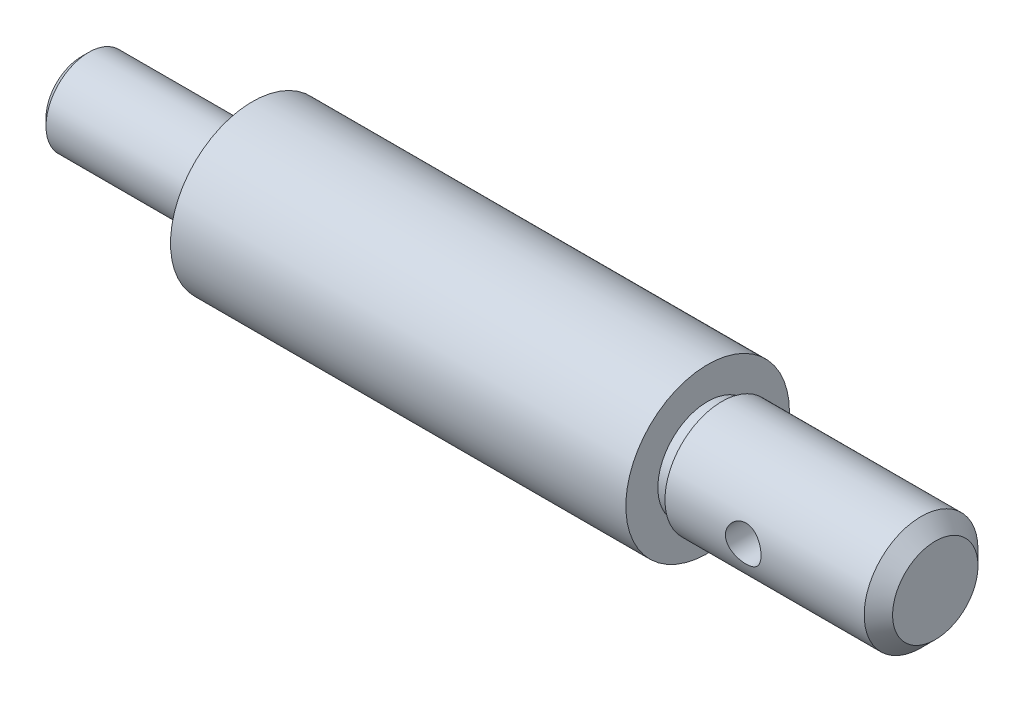
ISO-10303-21;
HEADER;
FILE_DESCRIPTION(('STEP AP214'),'2;1');
FILE_NAME('part.step','',(''),(''),'','','');
FILE_SCHEMA(('AUTOMOTIVE_DESIGN { 1 0 10303 214 1 1 1 1 }'));
ENDSEC;
DATA;
#1=APPLICATION_CONTEXT('core data for automotive mechanical design processes');
#2=APPLICATION_PROTOCOL_DEFINITION('international standard','automotive_design',2000,#1);
#3=PRODUCT_CONTEXT('',#1,'mechanical');
#4=PRODUCT('Part','Part','',(#3));
#5=PRODUCT_RELATED_PRODUCT_CATEGORY('part','',(#4));
#6=PRODUCT_DEFINITION_FORMATION('','',#4);
#7=PRODUCT_DEFINITION_CONTEXT('part definition',#1,'design');
#8=PRODUCT_DEFINITION('design','',#6,#7);
#9=PRODUCT_DEFINITION_SHAPE('','',#8);
#10=(LENGTH_UNIT() NAMED_UNIT(*) SI_UNIT(.MILLI.,.METRE.));
#11=(NAMED_UNIT(*) PLANE_ANGLE_UNIT() SI_UNIT($,.RADIAN.));
#12=(NAMED_UNIT(*) SI_UNIT($,.STERADIAN.) SOLID_ANGLE_UNIT());
#13=UNCERTAINTY_MEASURE_WITH_UNIT(LENGTH_MEASURE(1.E-05),#10,'distance_accuracy_value','');
#14=(GEOMETRIC_REPRESENTATION_CONTEXT(3) GLOBAL_UNCERTAINTY_ASSIGNED_CONTEXT((#13)) GLOBAL_UNIT_ASSIGNED_CONTEXT((#10,
#11,#12)) REPRESENTATION_CONTEXT('',''));
#15=CARTESIAN_POINT('',(0.,0.,0.));
#16=DIRECTION('',(0.,0.,1.));
#17=DIRECTION('',(1.,0.,0.));
#18=AXIS2_PLACEMENT_3D('',#15,#16,#17);
#19=CARTESIAN_POINT('',(0.,0.,0.));
#20=DIRECTION('',(1.,0.,0.));
#21=DIRECTION('',(0.,0.,-1.));
#22=AXIS2_PLACEMENT_3D('',#19,#20,#21);
#23=PLANE('',#22);
#24=CARTESIAN_POINT('',(0.,0.,0.));
#25=DIRECTION('',(1.,0.,0.));
#26=DIRECTION('',(0.,0.,-1.));
#27=AXIS2_PLACEMENT_3D('',#24,#25,#26);
#28=CIRCLE('',#27,5.99999999999998);
#29=CARTESIAN_POINT('',(0.,0.,-5.99999999999998));
#30=VERTEX_POINT('',#29);
#31=EDGE_CURVE('E48',#30,#30,#28,.T.);
#32=ORIENTED_EDGE('',*,*,#31,.T.);
#33=EDGE_LOOP('',(#32));
#34=FACE_BOUND('',#33,.T.);
#35=ADVANCED_FACE('F33',(#34),#23,.T.);
#36=CARTESIAN_POINT('',(0.,0.,0.));
#37=DIRECTION('',(1.,0.,0.));
#38=DIRECTION('',(0.,0.,-1.));
#39=AXIS2_PLACEMENT_3D('',#36,#37,#38);
#40=CYLINDRICAL_SURFACE('',#39,8.);
#41=CARTESIAN_POINT('',(-2.00000000000002,0.,0.));
#42=DIRECTION('',(1.,0.,0.));
#43=DIRECTION('',(0.,0.,-1.));
#44=AXIS2_PLACEMENT_3D('',#41,#42,#43);
#45=CIRCLE('',#44,8.);
#46=CARTESIAN_POINT('',(-2.00000000000002,0.,-8.));
#47=VERTEX_POINT('',#46);
#48=EDGE_CURVE('E44',#47,#47,#45,.F.);
#49=ORIENTED_EDGE('',*,*,#48,.T.);
#50=EDGE_LOOP('',(#49));
#51=FACE_BOUND('',#50,.T.);
#52=CARTESIAN_POINT('',(-21.5,0.,-8.));
#53=CARTESIAN_POINT('',(-21.4999991068248,0.136878370349093,-7.9999993175598));
#54=CARTESIAN_POINT('',(-21.4887215461111,0.273766105005719,-7.99645389969682));
#55=CARTESIAN_POINT('',(-21.4440275169215,0.543538419176897,-7.98265788177613));
#56=CARTESIAN_POINT('',(-21.4106060372713,0.676422085451814,-7.97240576399719));
#57=CARTESIAN_POINT('',(-21.3228612576085,0.934257087301613,-7.94631631395819));
#58=CARTESIAN_POINT('',(-21.2685703106941,1.05922035397161,-7.9304876299805));
#59=CARTESIAN_POINT('',(-21.1407653646433,1.29826960469292,-7.89487938322185));
#60=CARTESIAN_POINT('',(-21.0672483364388,1.41235387088977,-7.8750991979981));
#61=CARTESIAN_POINT('',(-20.9006880159653,1.62993066990456,-7.83300427480565));
#62=CARTESIAN_POINT('',(-20.8071582298779,1.73304005631332,-7.81063431853978));
#63=CARTESIAN_POINT('',(-20.6042632151729,1.92239476407399,-7.76620092748417));
#64=CARTESIAN_POINT('',(-20.4948950450109,2.00863694579739,-7.74413755046914));
#65=CARTESIAN_POINT('',(-20.2601108723838,2.16388672966227,-7.70222289396344));
#66=CARTESIAN_POINT('',(-20.1343650449456,2.23241568300257,-7.68243976603591));
#67=CARTESIAN_POINT('',(-19.8724153700363,2.34719482153343,-7.64815603598469));
#68=CARTESIAN_POINT('',(-19.7362142884121,2.39345087543889,-7.63365404257377));
#69=CARTESIAN_POINT('',(-19.4615438450959,2.46096919860067,-7.61215213969002));
#70=CARTESIAN_POINT('',(-19.3232663127223,2.48294220015729,-7.60493945859016));
#71=CARTESIAN_POINT('',(-19.0448137621762,2.50349110073976,-7.59820110281901));
#72=CARTESIAN_POINT('',(-18.9046392583567,2.50207321991544,-7.59867338454669));
#73=CARTESIAN_POINT('',(-18.632251079462,2.47643649465478,-7.60706378150876));
#74=CARTESIAN_POINT('',(-18.4999417482769,2.45312115738766,-7.61468683491897));
#75=CARTESIAN_POINT('',(-18.2412156869253,2.38581626711252,-7.63604051304978));
#76=CARTESIAN_POINT('',(-18.1147995845824,2.34182451689101,-7.6497717868623));
#77=CARTESIAN_POINT('',(-17.8692961111347,2.23377749362554,-7.68202088028593));
#78=CARTESIAN_POINT('',(-17.750342778616,2.16943851324164,-7.70060569321649));
#79=CARTESIAN_POINT('',(-17.5246244642418,2.02272041475696,-7.7404371316014));
#80=CARTESIAN_POINT('',(-17.4178626594926,1.94033661043154,-7.76168444789102));
#81=CARTESIAN_POINT('',(-17.214450113166,1.75543390836424,-7.80563055600986));
#82=CARTESIAN_POINT('',(-17.1184808844406,1.65216914118563,-7.82835139211391));
#83=CARTESIAN_POINT('',(-16.9450562128406,1.43072881619106,-7.87183141519161));
#84=CARTESIAN_POINT('',(-16.8676021415616,1.31255215469804,-7.89259045676745));
#85=CARTESIAN_POINT('',(-16.7329446227974,1.06332922093091,-7.93002589780382));
#86=CARTESIAN_POINT('',(-16.6759037290721,0.932189813838557,-7.94666921296415));
#87=CARTESIAN_POINT('',(-16.5848939982969,0.661535955565287,-7.97375911657108));
#88=CARTESIAN_POINT('',(-16.5509181555232,0.522024061449215,-7.98420758650304));
#89=CARTESIAN_POINT('',(-16.508163914842,0.244370314580689,-7.99742778790027));
#90=CARTESIAN_POINT('',(-16.4984629128129,0.106383697577685,-8.00048045790873));
#91=CARTESIAN_POINT('',(-16.5019324532747,-0.169260611465173,-7.99939599461967));
#92=CARTESIAN_POINT('',(-16.5150996546452,-0.306918348613019,-7.9952599116227));
#93=CARTESIAN_POINT('',(-16.5631911852128,-0.574438665951699,-7.98044727539523));
#94=CARTESIAN_POINT('',(-16.597566535225,-0.704409956841875,-7.96993586221374));
#95=CARTESIAN_POINT('',(-16.6864287047334,-0.956703857722755,-7.94360242758579));
#96=CARTESIAN_POINT('',(-16.74091800805,-1.07902552089812,-7.92777975028687));
#97=CARTESIAN_POINT('',(-16.8699464330974,-1.31586481334438,-7.89197085518848));
#98=CARTESIAN_POINT('',(-16.9449419749936,-1.43011947957558,-7.87189253635335));
#99=CARTESIAN_POINT('',(-17.1123064202349,-1.64473170192052,-7.82986820006859));
#100=CARTESIAN_POINT('',(-17.2046800354893,-1.7450854760879,-7.80792167695774));
#101=CARTESIAN_POINT('',(-17.4085177801042,-1.93317492583804,-7.76353989766283));
#102=CARTESIAN_POINT('',(-17.5205933274784,-2.02025304679063,-7.74111973412883));
#103=CARTESIAN_POINT('',(-17.7582532327535,-2.17442500490303,-7.69923894191212));
#104=CARTESIAN_POINT('',(-17.883837376054,-2.24151915946859,-7.67977826622621));
#105=CARTESIAN_POINT('',(-18.144690345741,-2.35340166961084,-7.64623564661738));
#106=CARTESIAN_POINT('',(-18.2799192988714,-2.39827639112025,-7.63213292713749));
#107=CARTESIAN_POINT('',(-18.5565449864972,-2.4644578863618,-7.6110234168862));
#108=CARTESIAN_POINT('',(-18.6979393526871,-2.48577362827989,-7.60401392602456));
#109=CARTESIAN_POINT('',(-18.9760081751609,-2.50358812316251,-7.59816585427753));
#110=CARTESIAN_POINT('',(-19.1126069076948,-2.50116559243271,-7.59897209200284));
#111=CARTESIAN_POINT('',(-19.3833491698839,-2.47417636257667,-7.60780180751807));
#112=CARTESIAN_POINT('',(-19.5174928137735,-2.44961069645024,-7.61582494863208));
#113=CARTESIAN_POINT('',(-19.7775880791838,-2.37975459827235,-7.6379362836678));
#114=CARTESIAN_POINT('',(-19.9036308821867,-2.33477284812016,-7.65193396380513));
#115=CARTESIAN_POINT('',(-20.146480827068,-2.22560454669999,-7.68439408509128));
#116=CARTESIAN_POINT('',(-20.2632860841568,-2.16141408888473,-7.70285743429343));
#117=CARTESIAN_POINT('',(-20.4892919408796,-2.01271350026986,-7.74306974067005));
#118=CARTESIAN_POINT('',(-20.5980162590005,-1.92750667048264,-7.76491897845913));
#119=CARTESIAN_POINT('',(-20.799972656224,-1.7404179928096,-7.8089799764242));
#120=CARTESIAN_POINT('',(-20.8932005779821,-1.63853168468878,-7.83119183213309));
#121=CARTESIAN_POINT('',(-21.0645650767259,-1.41697332564669,-7.87434543904947));
#122=CARTESIAN_POINT('',(-21.1421094728999,-1.29682914897477,-7.89522203461346));
#123=CARTESIAN_POINT('',(-21.2757978302789,-1.0445582760273,-7.93253538593756));
#124=CARTESIAN_POINT('',(-21.3319502042837,-0.912436315590894,-7.94897388631644));
#125=CARTESIAN_POINT('',(-21.4171827352169,-0.651495270747954,-7.97441301466941));
#126=CARTESIAN_POINT('',(-21.4481497346107,-0.523340674225089,-7.98392481612283));
#127=CARTESIAN_POINT('',(-21.4895567199354,-0.263459790880493,-7.99671800680967));
#128=CARTESIAN_POINT('',(-21.500000859608,-0.131734232279348,-8.00000065679286));
#129=CARTESIAN_POINT('',(-21.5,0.,-8.));
#130=B_SPLINE_CURVE_WITH_KNOTS('',3,(#52,#53,#54,#55,#56,#57,#58,#59,#60,#61,#62,#63,#64,#65,
#66,#67,#68,#69,#70,#71,#72,#73,#74,#75,#76,#77,#78,#79,#80,#81,#82,#83,#84,#85,#86,#87,#88,#89,
#90,#91,#92,#93,#94,#95,#96,#97,#98,#99,#100,#101,#102,#103,#104,#105,#106,#107,#108,#109,#110,
#111,#112,#113,#114,#115,#116,#117,#118,#119,#120,#121,#122,#123,#124,#125,#126,#127,#128,#129),
.UNSPECIFIED.,.T.,.F.,(4,2,2,2,2,2,2,2,2,2,2,2,2,2,2,2,2,2,2,2,2,2,2,2,2,2,2,2,2,2,2,2,2,2,2,2,
2,2,4),(0.,0.41015089886502,0.820394646698133,1.23000495840487,1.63967984311678,
2.06075644390316,2.48191134862552,2.91347542494988,3.34492572559054,3.7633830033442,
4.18172900590276,4.58353834844338,4.98539039958126,5.3931128544109,5.80094132020717,
6.227334945592,6.65376014826606,7.0835092137954,7.51312768989108,7.92615137096475,
8.33911471298725,8.74181253445744,9.14456010068999,9.55712649476686,9.96980491418519,
10.3988355742628,10.8278594196742,11.2552023150671,11.6823824779468,12.0902440696666,
12.4980866352126,12.8999582681244,13.3019116867944,13.7195902803182,14.1373807476578,
14.5688133627192,15.0000761335177,15.3948927332218,15.7896294154519),.UNSPECIFIED.);
#131=CARTESIAN_POINT('',(-21.5,0.,-8.));
#132=VERTEX_POINT('',#131);
#133=EDGE_CURVE('E54',#132,#132,#130,.T.);
#134=ORIENTED_EDGE('',*,*,#133,.F.);
#135=EDGE_LOOP('',(#134));
#136=FACE_BOUND('',#135,.T.);
#137=CARTESIAN_POINT('',(-16.5,0.,8.));
#138=CARTESIAN_POINT('',(-16.5000008931752,0.136878370349093,7.9999993175598));
#139=CARTESIAN_POINT('',(-16.5112784538889,0.273766105005719,7.99645389969682));
#140=CARTESIAN_POINT('',(-16.5559724830785,0.543538419176897,7.98265788177613));
#141=CARTESIAN_POINT('',(-16.5893939627287,0.676422085451814,7.97240576399719));
#142=CARTESIAN_POINT('',(-16.6771387423915,0.934257087301613,7.94631631395819));
#143=CARTESIAN_POINT('',(-16.7314296893059,1.05922035397161,7.9304876299805));
#144=CARTESIAN_POINT('',(-16.8592346353567,1.29826960469292,7.89487938322185));
#145=CARTESIAN_POINT('',(-16.9327516635612,1.41235387088977,7.8750991979981));
#146=CARTESIAN_POINT('',(-17.0993119840347,1.62993066990456,7.83300427480565));
#147=CARTESIAN_POINT('',(-17.1928417701221,1.73304005631332,7.81063431853978));
#148=CARTESIAN_POINT('',(-17.3957367848271,1.92239476407399,7.76620092748417));
#149=CARTESIAN_POINT('',(-17.5051049549891,2.00863694579739,7.74413755046914));
#150=CARTESIAN_POINT('',(-17.7398891276162,2.16388672966227,7.70222289396344));
#151=CARTESIAN_POINT('',(-17.8656349550544,2.23241568300257,7.68243976603591));
#152=CARTESIAN_POINT('',(-18.1275846299637,2.34719482153343,7.64815603598469));
#153=CARTESIAN_POINT('',(-18.2637857115879,2.39345087543889,7.63365404257377));
#154=CARTESIAN_POINT('',(-18.5384561549041,2.46096919860067,7.61215213969002));
#155=CARTESIAN_POINT('',(-18.6767336872777,2.48294220015729,7.60493945859017));
#156=CARTESIAN_POINT('',(-18.9551862378238,2.50349110073976,7.59820110281901));
#157=CARTESIAN_POINT('',(-19.0953607416433,2.50207321991544,7.59867338454669));
#158=CARTESIAN_POINT('',(-19.367748920538,2.47643649465478,7.60706378150876));
#159=CARTESIAN_POINT('',(-19.5000582517231,2.45312115738766,7.61468683491897));
#160=CARTESIAN_POINT('',(-19.7587843130747,2.38581626711252,7.63604051304978));
#161=CARTESIAN_POINT('',(-19.8852004154176,2.34182451689101,7.6497717868623));
#162=CARTESIAN_POINT('',(-20.1307038888653,2.23377749362554,7.68202088028593));
#163=CARTESIAN_POINT('',(-20.249657221384,2.16943851324164,7.70060569321649));
#164=CARTESIAN_POINT('',(-20.4753755357582,2.02272041475696,7.7404371316014));
#165=CARTESIAN_POINT('',(-20.5821373405074,1.94033661043154,7.76168444789102));
#166=CARTESIAN_POINT('',(-20.785549886834,1.75543390836424,7.80563055600986));
#167=CARTESIAN_POINT('',(-20.8815191155594,1.65216914118563,7.82835139211391));
#168=CARTESIAN_POINT('',(-21.0549437871594,1.43072881619106,7.87183141519161));
#169=CARTESIAN_POINT('',(-21.1323978584384,1.31255215469804,7.89259045676745));
#170=CARTESIAN_POINT('',(-21.2670553772025,1.06332922093091,7.93002589780382));
#171=CARTESIAN_POINT('',(-21.3240962709279,0.932189813838557,7.94666921296415));
#172=CARTESIAN_POINT('',(-21.4151060017031,0.661535955565287,7.97375911657108));
#173=CARTESIAN_POINT('',(-21.4490818444768,0.522024061449215,7.98420758650304));
#174=CARTESIAN_POINT('',(-21.491836085158,0.244370314580689,7.99742778790027));
#175=CARTESIAN_POINT('',(-21.501537087187,0.106383697577685,8.00048045790873));
#176=CARTESIAN_POINT('',(-21.4980675467253,-0.169260611465173,7.99939599461967));
#177=CARTESIAN_POINT('',(-21.4849003453548,-0.306918348613019,7.9952599116227));
#178=CARTESIAN_POINT('',(-21.4368088147872,-0.574438665951699,7.98044727539523));
#179=CARTESIAN_POINT('',(-21.402433464775,-0.704409956841875,7.96993586221374));
#180=CARTESIAN_POINT('',(-21.3135712952666,-0.956703857722755,7.94360242758579));
#181=CARTESIAN_POINT('',(-21.25908199195,-1.07902552089812,7.92777975028687));
#182=CARTESIAN_POINT('',(-21.1300535669026,-1.31586481334438,7.89197085518848));
#183=CARTESIAN_POINT('',(-21.0550580250064,-1.43011947957558,7.87189253635335));
#184=CARTESIAN_POINT('',(-20.8876935797651,-1.64473170192052,7.82986820006859));
#185=CARTESIAN_POINT('',(-20.7953199645107,-1.7450854760879,7.80792167695774));
#186=CARTESIAN_POINT('',(-20.5914822198958,-1.93317492583804,7.76353989766283));
#187=CARTESIAN_POINT('',(-20.4794066725216,-2.02025304679062,7.74111973412883));
#188=CARTESIAN_POINT('',(-20.2417467672464,-2.17442500490303,7.69923894191212));
#189=CARTESIAN_POINT('',(-20.116162623946,-2.24151915946859,7.67977826622621));
#190=CARTESIAN_POINT('',(-19.855309654259,-2.35340166961084,7.64623564661738));
#191=CARTESIAN_POINT('',(-19.7200807011286,-2.39827639112025,7.63213292713749));
#192=CARTESIAN_POINT('',(-19.4434550135028,-2.4644578863618,7.6110234168862));
#193=CARTESIAN_POINT('',(-19.3020606473129,-2.48577362827989,7.60401392602456));
#194=CARTESIAN_POINT('',(-19.0239918248391,-2.50358812316251,7.59816585427753));
#195=CARTESIAN_POINT('',(-18.8873930923052,-2.50116559243271,7.59897209200284));
#196=CARTESIAN_POINT('',(-18.6166508301161,-2.47417636257667,7.60780180751807));
#197=CARTESIAN_POINT('',(-18.4825071862265,-2.44961069645024,7.61582494863208));
#198=CARTESIAN_POINT('',(-18.2224119208162,-2.37975459827235,7.6379362836678));
#199=CARTESIAN_POINT('',(-18.0963691178133,-2.33477284812016,7.65193396380514));
#200=CARTESIAN_POINT('',(-17.853519172932,-2.22560454669999,7.68439408509128));
#201=CARTESIAN_POINT('',(-17.7367139158432,-2.16141408888473,7.70285743429343));
#202=CARTESIAN_POINT('',(-17.5107080591204,-2.01271350026986,7.74306974067005));
#203=CARTESIAN_POINT('',(-17.4019837409995,-1.92750667048265,7.76491897845913));
#204=CARTESIAN_POINT('',(-17.200027343776,-1.7404179928096,7.8089799764242));
#205=CARTESIAN_POINT('',(-17.1067994220179,-1.63853168468878,7.83119183213309));
#206=CARTESIAN_POINT('',(-16.9354349232741,-1.41697332564669,7.87434543904947));
#207=CARTESIAN_POINT('',(-16.8578905271001,-1.29682914897477,7.89522203461346));
#208=CARTESIAN_POINT('',(-16.7242021697211,-1.0445582760273,7.93253538593756));
#209=CARTESIAN_POINT('',(-16.6680497957163,-0.912436315590894,7.94897388631644));
#210=CARTESIAN_POINT('',(-16.5828172647831,-0.651495270747954,7.97441301466941));
#211=CARTESIAN_POINT('',(-16.5518502653893,-0.523340674225089,7.98392481612283));
#212=CARTESIAN_POINT('',(-16.5104432800646,-0.263459790880493,7.99671800680967));
#213=CARTESIAN_POINT('',(-16.499999140392,-0.131734232279348,8.00000065679286));
#214=CARTESIAN_POINT('',(-16.5,0.,8.));
#215=B_SPLINE_CURVE_WITH_KNOTS('',3,(#137,#138,#139,#140,#141,#142,#143,#144,#145,#146,#147,
#148,#149,#150,#151,#152,#153,#154,#155,#156,#157,#158,#159,#160,#161,#162,#163,#164,#165,#166,
#167,#168,#169,#170,#171,#172,#173,#174,#175,#176,#177,#178,#179,#180,#181,#182,#183,#184,#185,
#186,#187,#188,#189,#190,#191,#192,#193,#194,#195,#196,#197,#198,#199,#200,#201,#202,#203,#204,
#205,#206,#207,#208,#209,#210,#211,#212,#213,#214),.UNSPECIFIED.,.T.,.F.,(4,2,2,2,2,2,2,2,2,2,2,
2,2,2,2,2,2,2,2,2,2,2,2,2,2,2,2,2,2,2,2,2,2,2,2,2,2,2,4),(0.,0.41015089886502,0.820394646698133,
1.23000495840487,1.63967984311678,2.06075644390316,2.48191134862552,2.91347542494988,
3.34492572559054,3.76338300334419,4.18172900590276,4.58353834844338,4.98539039958126,
5.3931128544109,5.80094132020717,6.227334945592,6.65376014826606,7.0835092137954,
7.51312768989108,7.92615137096475,8.33911471298725,8.74181253445744,9.14456010068999,
9.55712649476686,9.96980491418519,10.3988355742628,10.8278594196742,11.2552023150671,
11.6823824779468,12.0902440696666,12.4980866352126,12.8999582681244,13.3019116867944,
13.7195902803182,14.1373807476578,14.5688133627192,15.0000761335177,15.3948927332218,
15.7896294154519),.UNSPECIFIED.);
#216=CARTESIAN_POINT('',(-16.5,0.,8.));
#217=VERTEX_POINT('',#216);
#218=EDGE_CURVE('E63',#217,#217,#215,.T.);
#219=ORIENTED_EDGE('',*,*,#218,.F.);
#220=EDGE_LOOP('',(#219));
#221=FACE_BOUND('',#220,.T.);
#222=CARTESIAN_POINT('',(-30.,0.,0.));
#223=DIRECTION('',(1.,0.,0.));
#224=DIRECTION('',(0.,0.,-1.));
#225=AXIS2_PLACEMENT_3D('',#222,#223,#224);
#226=CIRCLE('',#225,8.);
#227=CARTESIAN_POINT('',(-30.,0.,-8.));
#228=VERTEX_POINT('',#227);
#229=EDGE_CURVE('E53',#228,#228,#226,.T.);
#230=ORIENTED_EDGE('',*,*,#229,.T.);
#231=EDGE_LOOP('',(#230));
#232=FACE_BOUND('',#231,.T.);
#233=ADVANCED_FACE('F68',(#51,#136,#221,#232),#40,.T.);
#234=CARTESIAN_POINT('',(-30.,7.,0.));
#235=DIRECTION('',(-1.,0.,0.));
#236=DIRECTION('',(0.,0.,1.));
#237=AXIS2_PLACEMENT_3D('',#234,#235,#236);
#238=PLANE('',#237);
#239=CARTESIAN_POINT('',(-30.,0.,0.));
#240=DIRECTION('',(1.,0.,0.));
#241=DIRECTION('',(0.,0.,-1.));
#242=AXIS2_PLACEMENT_3D('',#239,#240,#241);
#243=CIRCLE('',#242,7.);
#244=CARTESIAN_POINT('',(-30.,0.,-7.));
#245=VERTEX_POINT('',#244);
#246=EDGE_CURVE('E138',#245,#245,#243,.T.);
#247=ORIENTED_EDGE('',*,*,#246,.T.);
#248=EDGE_LOOP('',(#247));
#249=FACE_BOUND('',#248,.T.);
#250=ORIENTED_EDGE('',*,*,#229,.F.);
#251=EDGE_LOOP('',(#250));
#252=FACE_BOUND('',#251,.T.);
#253=ADVANCED_FACE('F107',(#249,#252),#238,.T.);
#254=CARTESIAN_POINT('',(0.,0.,0.));
#255=DIRECTION('',(1.,0.,0.));
#256=DIRECTION('',(0.,0.,-1.));
#257=AXIS2_PLACEMENT_3D('',#254,#255,#256);
#258=CYLINDRICAL_SURFACE('',#257,7.);
#259=CARTESIAN_POINT('',(-32.,0.,0.));
#260=DIRECTION('',(1.,0.,0.));
#261=DIRECTION('',(0.,0.,-1.));
#262=AXIS2_PLACEMENT_3D('',#259,#260,#261);
#263=CIRCLE('',#262,7.);
#264=CARTESIAN_POINT('',(-32.,0.,-7.));
#265=VERTEX_POINT('',#264);
#266=EDGE_CURVE('E139',#265,#265,#263,.T.);
#267=ORIENTED_EDGE('',*,*,#266,.T.);
#268=EDGE_LOOP('',(#267));
#269=FACE_BOUND('',#268,.T.);
#270=ORIENTED_EDGE('',*,*,#246,.F.);
#271=EDGE_LOOP('',(#270));
#272=FACE_BOUND('',#271,.T.);
#273=ADVANCED_FACE('F104',(#269,#272),#258,.T.);
#274=CARTESIAN_POINT('',(-32.,7.,0.));
#275=DIRECTION('',(1.,0.,0.));
#276=DIRECTION('',(0.,0.,-1.));
#277=AXIS2_PLACEMENT_3D('',#274,#275,#276);
#278=PLANE('',#277);
#279=CARTESIAN_POINT('',(-32.,0.,0.));
#280=DIRECTION('',(1.,0.,0.));
#281=DIRECTION('',(0.,0.,-1.));
#282=AXIS2_PLACEMENT_3D('',#279,#280,#281);
#283=CIRCLE('',#282,11.5);
#284=CARTESIAN_POINT('',(-32.,0.,-11.5));
#285=VERTEX_POINT('',#284);
#286=EDGE_CURVE('E144',#285,#285,#283,.T.);
#287=ORIENTED_EDGE('',*,*,#286,.T.);
#288=EDGE_LOOP('',(#287));
#289=FACE_BOUND('',#288,.T.);
#290=ORIENTED_EDGE('',*,*,#266,.F.);
#291=EDGE_LOOP('',(#290));
#292=FACE_BOUND('',#291,.T.);
#293=ADVANCED_FACE('F100',(#289,#292),#278,.T.);
#294=CARTESIAN_POINT('',(0.,0.,0.));
#295=DIRECTION('',(1.,0.,0.));
#296=DIRECTION('',(0.,0.,-1.));
#297=AXIS2_PLACEMENT_3D('',#294,#295,#296);
#298=CYLINDRICAL_SURFACE('',#297,11.5);
#299=CARTESIAN_POINT('',(-96.,0.,0.));
#300=DIRECTION('',(1.,0.,0.));
#301=DIRECTION('',(0.,0.,-1.));
#302=AXIS2_PLACEMENT_3D('',#299,#300,#301);
#303=CIRCLE('',#302,11.5);
#304=CARTESIAN_POINT('',(-96.,0.,-11.5));
#305=VERTEX_POINT('',#304);
#306=EDGE_CURVE('E147',#305,#305,#303,.T.);
#307=ORIENTED_EDGE('',*,*,#306,.T.);
#308=EDGE_LOOP('',(#307));
#309=FACE_BOUND('',#308,.T.);
#310=ORIENTED_EDGE('',*,*,#286,.F.);
#311=EDGE_LOOP('',(#310));
#312=FACE_BOUND('',#311,.T.);
#313=ADVANCED_FACE('F96',(#309,#312),#298,.T.);
#314=CARTESIAN_POINT('',(-96.,5.,0.));
#315=DIRECTION('',(-1.,0.,0.));
#316=DIRECTION('',(0.,0.,1.));
#317=AXIS2_PLACEMENT_3D('',#314,#315,#316);
#318=PLANE('',#317);
#319=CARTESIAN_POINT('',(-96.,0.,0.));
#320=DIRECTION('',(1.,0.,0.));
#321=DIRECTION('',(0.,0.,-1.));
#322=AXIS2_PLACEMENT_3D('',#319,#320,#321);
#323=CIRCLE('',#322,5.);
#324=CARTESIAN_POINT('',(-96.,0.,-5.));
#325=VERTEX_POINT('',#324);
#326=EDGE_CURVE('E150',#325,#325,#323,.T.);
#327=ORIENTED_EDGE('',*,*,#326,.T.);
#328=EDGE_LOOP('',(#327));
#329=FACE_BOUND('',#328,.T.);
#330=ORIENTED_EDGE('',*,*,#306,.F.);
#331=EDGE_LOOP('',(#330));
#332=FACE_BOUND('',#331,.T.);
#333=ADVANCED_FACE('F92',(#329,#332),#318,.T.);
#334=CARTESIAN_POINT('',(0.,0.,0.));
#335=DIRECTION('',(1.,0.,0.));
#336=DIRECTION('',(0.,0.,-1.));
#337=AXIS2_PLACEMENT_3D('',#334,#335,#336);
#338=CYLINDRICAL_SURFACE('',#337,5.);
#339=CARTESIAN_POINT('',(-98.,0.,0.));
#340=DIRECTION('',(1.,0.,0.));
#341=DIRECTION('',(0.,0.,-1.));
#342=AXIS2_PLACEMENT_3D('',#339,#340,#341);
#343=CIRCLE('',#342,5.);
#344=CARTESIAN_POINT('',(-98.,0.,-5.));
#345=VERTEX_POINT('',#344);
#346=EDGE_CURVE('E153',#345,#345,#343,.T.);
#347=ORIENTED_EDGE('',*,*,#346,.T.);
#348=EDGE_LOOP('',(#347));
#349=FACE_BOUND('',#348,.T.);
#350=ORIENTED_EDGE('',*,*,#326,.F.);
#351=EDGE_LOOP('',(#350));
#352=FACE_BOUND('',#351,.T.);
#353=ADVANCED_FACE('F88',(#349,#352),#338,.T.);
#354=CARTESIAN_POINT('',(-98.,5.,0.));
#355=DIRECTION('',(1.,0.,0.));
#356=DIRECTION('',(0.,0.,-1.));
#357=AXIS2_PLACEMENT_3D('',#354,#355,#356);
#358=PLANE('',#357);
#359=CARTESIAN_POINT('',(-98.,0.,0.));
#360=DIRECTION('',(1.,0.,0.));
#361=DIRECTION('',(0.,0.,-1.));
#362=AXIS2_PLACEMENT_3D('',#359,#360,#361);
#363=CIRCLE('',#362,6.);
#364=CARTESIAN_POINT('',(-98.,0.,-6.));
#365=VERTEX_POINT('',#364);
#366=EDGE_CURVE('E62',#365,#365,#363,.T.);
#367=ORIENTED_EDGE('',*,*,#366,.T.);
#368=EDGE_LOOP('',(#367));
#369=FACE_BOUND('',#368,.T.);
#370=ORIENTED_EDGE('',*,*,#346,.F.);
#371=EDGE_LOOP('',(#370));
#372=FACE_BOUND('',#371,.T.);
#373=ADVANCED_FACE('F85',(#369,#372),#358,.T.);
#374=CARTESIAN_POINT('',(0.,0.,0.));
#375=DIRECTION('',(1.,0.,0.));
#376=DIRECTION('',(0.,0.,-1.));
#377=AXIS2_PLACEMENT_3D('',#374,#375,#376);
#378=CYLINDRICAL_SURFACE('',#377,6.);
#379=CARTESIAN_POINT('',(-119.,0.,0.));
#380=DIRECTION('',(-1.,0.,0.));
#381=DIRECTION('',(0.,0.,1.));
#382=AXIS2_PLACEMENT_3D('',#379,#380,#381);
#383=CIRCLE('',#382,6.);
#384=CARTESIAN_POINT('',(-119.,0.,6.));
#385=VERTEX_POINT('',#384);
#386=EDGE_CURVE('E40',#385,#385,#383,.F.);
#387=ORIENTED_EDGE('',*,*,#386,.T.);
#388=EDGE_LOOP('',(#387));
#389=FACE_BOUND('',#388,.T.);
#390=ORIENTED_EDGE('',*,*,#366,.F.);
#391=EDGE_LOOP('',(#390));
#392=FACE_BOUND('',#391,.T.);
#393=ADVANCED_FACE('F82',(#389,#392),#378,.T.);
#394=CARTESIAN_POINT('',(-120.,0.,0.));
#395=DIRECTION('',(-1.,0.,0.));
#396=DIRECTION('',(0.,0.,1.));
#397=AXIS2_PLACEMENT_3D('',#394,#395,#396);
#398=PLANE('',#397);
#399=CARTESIAN_POINT('',(-120.,0.,0.));
#400=DIRECTION('',(-1.,0.,0.));
#401=DIRECTION('',(0.,0.,1.));
#402=AXIS2_PLACEMENT_3D('',#399,#400,#401);
#403=CIRCLE('',#402,4.99999999999996);
#404=CARTESIAN_POINT('',(-120.,0.,4.99999999999996));
#405=VERTEX_POINT('',#404);
#406=EDGE_CURVE('E10',#405,#405,#403,.T.);
#407=ORIENTED_EDGE('',*,*,#406,.T.);
#408=EDGE_LOOP('',(#407));
#409=FACE_BOUND('',#408,.T.);
#410=ADVANCED_FACE('F77',(#409),#398,.T.);
#411=CARTESIAN_POINT('',(-19.,0.,-10.));
#412=DIRECTION('',(0.,0.,1.));
#413=DIRECTION('',(1.,0.,0.));
#414=AXIS2_PLACEMENT_3D('',#411,#412,#413);
#415=CYLINDRICAL_SURFACE('',#414,2.5);
#416=ORIENTED_EDGE('',*,*,#133,.T.);
#417=EDGE_LOOP('',(#416));
#418=FACE_BOUND('',#417,.T.);
#419=ORIENTED_EDGE('',*,*,#218,.T.);
#420=EDGE_LOOP('',(#419));
#421=FACE_BOUND('',#420,.T.);
#422=ADVANCED_FACE('F72',(#418,#421),#415,.F.);
#423=CARTESIAN_POINT('',(0.,0.,0.));
#424=DIRECTION('',(-1.,0.,0.));
#425=DIRECTION('',(0.,0.,1.));
#426=AXIS2_PLACEMENT_3D('',#423,#424,#425);
#427=CONICAL_SURFACE('',#426,5.99999999999998,0.785398163397448);
#428=ORIENTED_EDGE('',*,*,#48,.F.);
#429=EDGE_LOOP('',(#428));
#430=FACE_BOUND('',#429,.T.);
#431=ORIENTED_EDGE('',*,*,#31,.F.);
#432=EDGE_LOOP('',(#431));
#433=FACE_BOUND('',#432,.T.);
#434=ADVANCED_FACE('F76',(#430,#433),#427,.T.);
#435=CARTESIAN_POINT('',(-119.,0.,0.));
#436=DIRECTION('',(1.,0.,0.));
#437=DIRECTION('',(0.,0.,-1.));
#438=AXIS2_PLACEMENT_3D('',#435,#436,#437);
#439=CONICAL_SURFACE('',#438,6.,0.785398163397446);
#440=ORIENTED_EDGE('',*,*,#406,.F.);
#441=EDGE_LOOP('',(#440));
#442=FACE_BOUND('',#441,.T.);
#443=ORIENTED_EDGE('',*,*,#386,.F.);
#444=EDGE_LOOP('',(#443));
#445=FACE_BOUND('',#444,.T.);
#446=ADVANCED_FACE('F35',(#442,#445),#439,.T.);
#447=CLOSED_SHELL('',(#35,#233,#253,#273,#293,#313,#333,#353,#373,#393,#410,#422,#434,#446));
#448=MANIFOLD_SOLID_BREP('B2',#447);
#449=ADVANCED_BREP_SHAPE_REPRESENTATION('',(#18,#448),#14);
#450=SHAPE_DEFINITION_REPRESENTATION(#9,#449);
ENDSEC;
END-ISO-10303-21;
